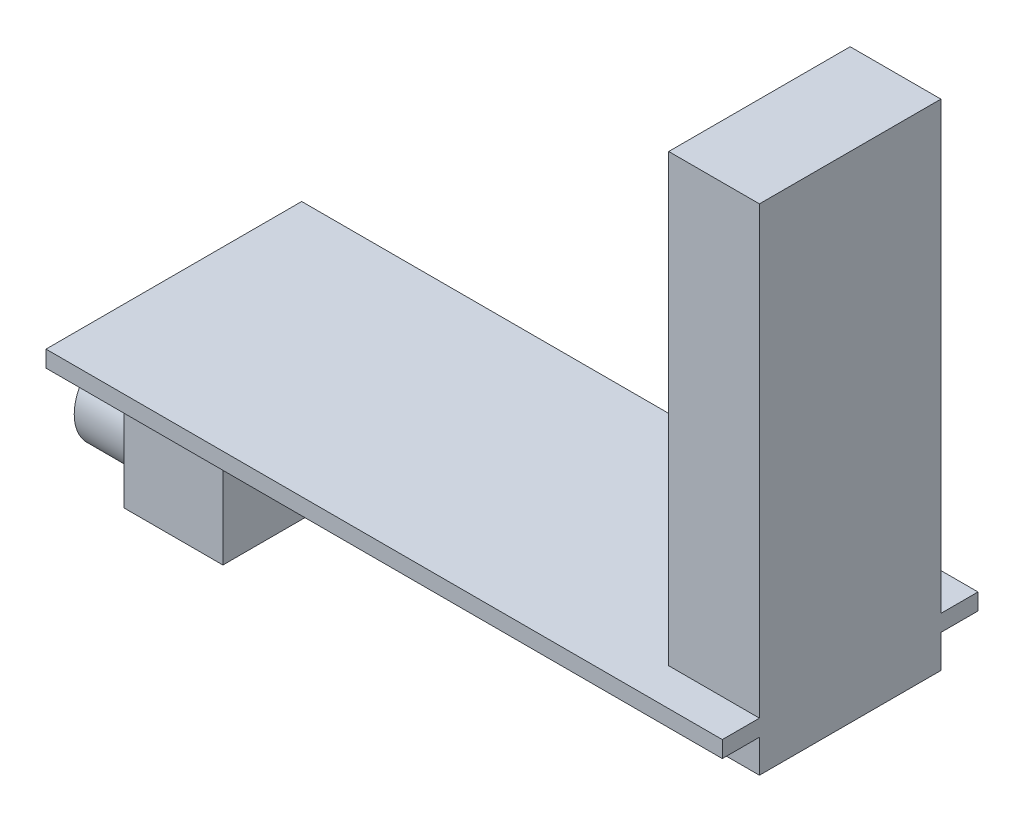
ISO-10303-21;
HEADER;
FILE_DESCRIPTION(('STEP AP214'),'2;1');
FILE_NAME('part.step','',(''),(''),'','','');
FILE_SCHEMA(('AUTOMOTIVE_DESIGN { 1 0 10303 214 1 1 1 1 }'));
ENDSEC;
DATA;
#1=APPLICATION_CONTEXT('core data for automotive mechanical design processes');
#2=APPLICATION_PROTOCOL_DEFINITION('international standard','automotive_design',2000,#1);
#3=PRODUCT_CONTEXT('',#1,'mechanical');
#4=PRODUCT('Part','Part','',(#3));
#5=PRODUCT_RELATED_PRODUCT_CATEGORY('part','',(#4));
#6=PRODUCT_DEFINITION_FORMATION('','',#4);
#7=PRODUCT_DEFINITION_CONTEXT('part definition',#1,'design');
#8=PRODUCT_DEFINITION('design','',#6,#7);
#9=PRODUCT_DEFINITION_SHAPE('','',#8);
#10=(LENGTH_UNIT() NAMED_UNIT(*) SI_UNIT(.MILLI.,.METRE.));
#11=(NAMED_UNIT(*) PLANE_ANGLE_UNIT() SI_UNIT($,.RADIAN.));
#12=(NAMED_UNIT(*) SI_UNIT($,.STERADIAN.) SOLID_ANGLE_UNIT());
#13=UNCERTAINTY_MEASURE_WITH_UNIT(LENGTH_MEASURE(1.E-05),#10,'distance_accuracy_value','');
#14=(GEOMETRIC_REPRESENTATION_CONTEXT(3) GLOBAL_UNCERTAINTY_ASSIGNED_CONTEXT((#13)) GLOBAL_UNIT_ASSIGNED_CONTEXT((#10,
#11,#12)) REPRESENTATION_CONTEXT('',''));
#15=CARTESIAN_POINT('',(0.,0.,0.));
#16=DIRECTION('',(0.,0.,1.));
#17=DIRECTION('',(1.,0.,0.));
#18=AXIS2_PLACEMENT_3D('',#15,#16,#17);
#19=CARTESIAN_POINT('',(0.,0.,0.));
#20=DIRECTION('',(0.,-1.,0.));
#21=DIRECTION('',(0.,0.,-1.));
#22=AXIS2_PLACEMENT_3D('',#19,#20,#21);
#23=PLANE('',#22);
#24=DIRECTION('',(0.,0.,1.));
#25=VECTOR('',#24,1.);
#26=CARTESIAN_POINT('',(-14.5,0.,0.));
#27=LINE('',#26,#25);
#28=CARTESIAN_POINT('',(-14.5,0.,-3.025));
#29=VERTEX_POINT('',#28);
#30=CARTESIAN_POINT('',(-14.5,0.,3.025));
#31=VERTEX_POINT('',#30);
#32=EDGE_CURVE('E531',#29,#31,#27,.T.);
#33=ORIENTED_EDGE('',*,*,#32,.F.);
#34=DIRECTION('',(1.,0.,0.));
#35=VECTOR('',#34,1.);
#36=CARTESIAN_POINT('',(0.,0.,-3.025));
#37=LINE('',#36,#35);
#38=CARTESIAN_POINT('',(-20.5,0.,-3.025));
#39=VERTEX_POINT('',#38);
#40=EDGE_CURVE('E183',#39,#29,#37,.T.);
#41=ORIENTED_EDGE('',*,*,#40,.F.);
#42=DIRECTION('',(0.,0.,1.));
#43=VECTOR('',#42,1.);
#44=CARTESIAN_POINT('',(-20.5,0.,7.75));
#45=LINE('',#44,#43);
#46=CARTESIAN_POINT('',(-20.5,0.,-7.75));
#47=VERTEX_POINT('',#46);
#48=EDGE_CURVE('E293',#47,#39,#45,.T.);
#49=ORIENTED_EDGE('',*,*,#48,.F.);
#50=DIRECTION('',(-1.,0.,0.));
#51=VECTOR('',#50,1.);
#52=CARTESIAN_POINT('',(-20.5,0.,-7.75));
#53=LINE('',#52,#51);
#54=CARTESIAN_POINT('',(20.5,0.,-7.75));
#55=VERTEX_POINT('',#54);
#56=EDGE_CURVE('E289',#55,#47,#53,.T.);
#57=ORIENTED_EDGE('',*,*,#56,.F.);
#58=DIRECTION('',(0.,0.,-1.));
#59=VECTOR('',#58,1.);
#60=CARTESIAN_POINT('',(20.5,0.,7.75));
#61=LINE('',#60,#59);
#62=CARTESIAN_POINT('',(20.5,0.,-5.5));
#63=VERTEX_POINT('',#62);
#64=EDGE_CURVE('E269',#63,#55,#61,.T.);
#65=ORIENTED_EDGE('',*,*,#64,.F.);
#66=DIRECTION('',(1.,0.,0.));
#67=VECTOR('',#66,1.);
#68=CARTESIAN_POINT('',(0.,0.,-5.5));
#69=LINE('',#68,#67);
#70=CARTESIAN_POINT('',(15.,0.,-5.5));
#71=VERTEX_POINT('',#70);
#72=EDGE_CURVE('E69',#71,#63,#69,.T.);
#73=ORIENTED_EDGE('',*,*,#72,.F.);
#74=DIRECTION('',(0.,0.,-1.));
#75=VECTOR('',#74,1.);
#76=CARTESIAN_POINT('',(15.,0.,0.));
#77=LINE('',#76,#75);
#78=CARTESIAN_POINT('',(15.,0.,5.5));
#79=VERTEX_POINT('',#78);
#80=EDGE_CURVE('E191',#79,#71,#77,.T.);
#81=ORIENTED_EDGE('',*,*,#80,.F.);
#82=DIRECTION('',(-1.,0.,0.));
#83=VECTOR('',#82,1.);
#84=CARTESIAN_POINT('',(0.,0.,5.5));
#85=LINE('',#84,#83);
#86=CARTESIAN_POINT('',(20.5,0.,5.5));
#87=VERTEX_POINT('',#86);
#88=EDGE_CURVE('E186',#87,#79,#85,.T.);
#89=ORIENTED_EDGE('',*,*,#88,.F.);
#90=CARTESIAN_POINT('',(20.5,0.,7.75));
#91=VERTEX_POINT('',#90);
#92=EDGE_CURVE('E285',#91,#87,#61,.T.);
#93=ORIENTED_EDGE('',*,*,#92,.F.);
#94=DIRECTION('',(1.,0.,0.));
#95=VECTOR('',#94,1.);
#96=CARTESIAN_POINT('',(-20.5,0.,7.75));
#97=LINE('',#96,#95);
#98=CARTESIAN_POINT('',(-20.5,0.,7.75));
#99=VERTEX_POINT('',#98);
#100=EDGE_CURVE('E297',#99,#91,#97,.T.);
#101=ORIENTED_EDGE('',*,*,#100,.F.);
#102=CARTESIAN_POINT('',(-20.5,0.,3.025));
#103=VERTEX_POINT('',#102);
#104=EDGE_CURVE('E292',#103,#99,#45,.T.);
#105=ORIENTED_EDGE('',*,*,#104,.F.);
#106=DIRECTION('',(1.,0.,0.));
#107=VECTOR('',#106,1.);
#108=CARTESIAN_POINT('',(0.,0.,3.025));
#109=LINE('',#108,#107);
#110=EDGE_CURVE('E61',#103,#31,#109,.T.);
#111=ORIENTED_EDGE('',*,*,#110,.T.);
#112=EDGE_LOOP('',(#33,#41,#49,#57,#65,#73,#81,#89,#93,#101,#105,#111));
#113=FACE_BOUND('',#112,.T.);
#114=ADVANCED_FACE('F45',(#113),#23,.T.);
#115=CARTESIAN_POINT('',(20.5,1.,7.75));
#116=DIRECTION('',(-1.,0.,0.));
#117=DIRECTION('',(0.,0.,1.));
#118=AXIS2_PLACEMENT_3D('',#115,#116,#117);
#119=PLANE('',#118);
#120=ORIENTED_EDGE('',*,*,#92,.T.);
#121=DIRECTION('',(0.,1.,0.));
#122=VECTOR('',#121,1.);
#123=CARTESIAN_POINT('',(20.5,-2.,5.5));
#124=LINE('',#123,#122);
#125=CARTESIAN_POINT('',(20.5,-2.,5.5));
#126=VERTEX_POINT('',#125);
#127=EDGE_CURVE('E226',#126,#87,#124,.T.);
#128=ORIENTED_EDGE('',*,*,#127,.F.);
#129=DIRECTION('',(0.,0.,1.));
#130=VECTOR('',#129,1.);
#131=CARTESIAN_POINT('',(20.5,-2.,0.));
#132=LINE('',#131,#130);
#133=CARTESIAN_POINT('',(20.5,-2.,-5.5));
#134=VERTEX_POINT('',#133);
#135=EDGE_CURVE('E197',#134,#126,#132,.T.);
#136=ORIENTED_EDGE('',*,*,#135,.F.);
#137=DIRECTION('',(0.,1.,0.));
#138=VECTOR('',#137,1.);
#139=CARTESIAN_POINT('',(20.5,-2.,-5.5));
#140=LINE('',#139,#138);
#141=EDGE_CURVE('E209',#134,#63,#140,.T.);
#142=ORIENTED_EDGE('',*,*,#141,.T.);
#143=ORIENTED_EDGE('',*,*,#64,.T.);
#144=DIRECTION('',(0.,-1.,0.));
#145=VECTOR('',#144,1.);
#146=CARTESIAN_POINT('',(20.5,1.,-7.75));
#147=LINE('',#146,#145);
#148=CARTESIAN_POINT('',(20.5,1.,-7.75));
#149=VERTEX_POINT('',#148);
#150=EDGE_CURVE('E54',#149,#55,#147,.T.);
#151=ORIENTED_EDGE('',*,*,#150,.F.);
#152=DIRECTION('',(0.,0.,-1.));
#153=VECTOR('',#152,1.);
#154=CARTESIAN_POINT('',(20.5,1.,7.75));
#155=LINE('',#154,#153);
#156=CARTESIAN_POINT('',(20.5,1.,-5.5));
#157=VERTEX_POINT('',#156);
#158=EDGE_CURVE('E275',#157,#149,#155,.T.);
#159=ORIENTED_EDGE('',*,*,#158,.F.);
#160=DIRECTION('',(0.,-1.,0.));
#161=VECTOR('',#160,1.);
#162=CARTESIAN_POINT('',(20.5,28.,-5.5));
#163=LINE('',#162,#161);
#164=CARTESIAN_POINT('',(20.5,28.,-5.5));
#165=VERTEX_POINT('',#164);
#166=EDGE_CURVE('E246',#165,#157,#163,.T.);
#167=ORIENTED_EDGE('',*,*,#166,.F.);
#168=DIRECTION('',(0.,0.,-1.));
#169=VECTOR('',#168,1.);
#170=CARTESIAN_POINT('',(20.5,28.,0.));
#171=LINE('',#170,#169);
#172=CARTESIAN_POINT('',(20.5,28.,5.5));
#173=VERTEX_POINT('',#172);
#174=EDGE_CURVE('E243',#173,#165,#171,.T.);
#175=ORIENTED_EDGE('',*,*,#174,.F.);
#176=DIRECTION('',(0.,-1.,0.));
#177=VECTOR('',#176,1.);
#178=CARTESIAN_POINT('',(20.5,28.,5.5));
#179=LINE('',#178,#177);
#180=CARTESIAN_POINT('',(20.5,1.,5.5));
#181=VERTEX_POINT('',#180);
#182=EDGE_CURVE('E258',#173,#181,#179,.T.);
#183=ORIENTED_EDGE('',*,*,#182,.T.);
#184=CARTESIAN_POINT('',(20.5,1.,7.75));
#185=VERTEX_POINT('',#184);
#186=EDGE_CURVE('E270',#185,#181,#155,.T.);
#187=ORIENTED_EDGE('',*,*,#186,.F.);
#188=DIRECTION('',(0.,-1.,0.));
#189=VECTOR('',#188,1.);
#190=CARTESIAN_POINT('',(20.5,1.,7.75));
#191=LINE('',#190,#189);
#192=EDGE_CURVE('E284',#185,#91,#191,.T.);
#193=ORIENTED_EDGE('',*,*,#192,.T.);
#194=EDGE_LOOP('',(#120,#128,#136,#142,#143,#151,#159,#167,#175,#183,#187,#193));
#195=FACE_BOUND('',#194,.T.);
#196=ADVANCED_FACE('F47',(#195),#119,.F.);
#197=CARTESIAN_POINT('',(-20.5,1.,-7.75));
#198=DIRECTION('',(0.,0.,1.));
#199=DIRECTION('',(1.,0.,0.));
#200=AXIS2_PLACEMENT_3D('',#197,#198,#199);
#201=PLANE('',#200);
#202=ORIENTED_EDGE('',*,*,#56,.T.);
#203=DIRECTION('',(0.,-1.,0.));
#204=VECTOR('',#203,1.);
#205=CARTESIAN_POINT('',(-20.5,1.,-7.75));
#206=LINE('',#205,#204);
#207=CARTESIAN_POINT('',(-20.5,1.,-7.75));
#208=VERTEX_POINT('',#207);
#209=EDGE_CURVE('E307',#208,#47,#206,.T.);
#210=ORIENTED_EDGE('',*,*,#209,.F.);
#211=DIRECTION('',(-1.,0.,0.));
#212=VECTOR('',#211,1.);
#213=CARTESIAN_POINT('',(-20.5,1.,-7.75));
#214=LINE('',#213,#212);
#215=EDGE_CURVE('E274',#149,#208,#214,.T.);
#216=ORIENTED_EDGE('',*,*,#215,.F.);
#217=ORIENTED_EDGE('',*,*,#150,.T.);
#218=EDGE_LOOP('',(#202,#210,#216,#217));
#219=FACE_BOUND('',#218,.T.);
#220=ADVANCED_FACE('F315',(#219),#201,.F.);
#221=CARTESIAN_POINT('',(-20.5,1.,7.75));
#222=DIRECTION('',(1.,0.,0.));
#223=DIRECTION('',(0.,0.,-1.));
#224=AXIS2_PLACEMENT_3D('',#221,#222,#223);
#225=PLANE('',#224);
#226=CARTESIAN_POINT('',(-20.5,-6.67922826841348,0.));
#227=DIRECTION('',(1.,0.,0.));
#228=DIRECTION('',(0.,0.,-1.));
#229=AXIS2_PLACEMENT_3D('',#226,#227,#228);
#230=CIRCLE('',#229,2.64);
#231=CARTESIAN_POINT('',(-20.5,-6.67922826841348,-2.64));
#232=VERTEX_POINT('',#231);
#233=EDGE_CURVE('E11',#232,#232,#230,.F.);
#234=ORIENTED_EDGE('',*,*,#233,.F.);
#235=EDGE_LOOP('',(#234));
#236=FACE_BOUND('',#235,.T.);
#237=ORIENTED_EDGE('',*,*,#48,.T.);
#238=DIRECTION('',(0.,1.,0.));
#239=VECTOR('',#238,1.);
#240=CARTESIAN_POINT('',(-20.5,-9.7,-3.025));
#241=LINE('',#240,#239);
#242=CARTESIAN_POINT('',(-20.5,-9.7,-3.025));
#243=VERTEX_POINT('',#242);
#244=EDGE_CURVE('E327',#243,#39,#241,.T.);
#245=ORIENTED_EDGE('',*,*,#244,.F.);
#246=DIRECTION('',(0.,0.,-1.));
#247=VECTOR('',#246,1.);
#248=CARTESIAN_POINT('',(-20.5,-9.7,0.));
#249=LINE('',#248,#247);
#250=CARTESIAN_POINT('',(-20.5,-9.7,3.025));
#251=VERTEX_POINT('',#250);
#252=EDGE_CURVE('E176',#251,#243,#249,.T.);
#253=ORIENTED_EDGE('',*,*,#252,.F.);
#254=DIRECTION('',(0.,1.,0.));
#255=VECTOR('',#254,1.);
#256=CARTESIAN_POINT('',(-20.5,-9.7,3.025));
#257=LINE('',#256,#255);
#258=EDGE_CURVE('E193',#251,#103,#257,.T.);
#259=ORIENTED_EDGE('',*,*,#258,.T.);
#260=ORIENTED_EDGE('',*,*,#104,.T.);
#261=DIRECTION('',(0.,-1.,0.));
#262=VECTOR('',#261,1.);
#263=CARTESIAN_POINT('',(-20.5,1.,7.75));
#264=LINE('',#263,#262);
#265=CARTESIAN_POINT('',(-20.5,1.,7.75));
#266=VERTEX_POINT('',#265);
#267=EDGE_CURVE('E303',#266,#99,#264,.T.);
#268=ORIENTED_EDGE('',*,*,#267,.F.);
#269=DIRECTION('',(0.,0.,1.));
#270=VECTOR('',#269,1.);
#271=CARTESIAN_POINT('',(-20.5,1.,7.75));
#272=LINE('',#271,#270);
#273=EDGE_CURVE('E278',#208,#266,#272,.T.);
#274=ORIENTED_EDGE('',*,*,#273,.F.);
#275=ORIENTED_EDGE('',*,*,#209,.T.);
#276=EDGE_LOOP('',(#237,#245,#253,#259,#260,#268,#274,#275));
#277=FACE_BOUND('',#276,.T.);
#278=ADVANCED_FACE('F326',(#236,#277),#225,.F.);
#279=CARTESIAN_POINT('',(-20.5,1.,7.75));
#280=DIRECTION('',(0.,0.,-1.));
#281=DIRECTION('',(-1.,0.,0.));
#282=AXIS2_PLACEMENT_3D('',#279,#280,#281);
#283=PLANE('',#282);
#284=ORIENTED_EDGE('',*,*,#100,.T.);
#285=ORIENTED_EDGE('',*,*,#192,.F.);
#286=DIRECTION('',(1.,0.,0.));
#287=VECTOR('',#286,1.);
#288=CARTESIAN_POINT('',(-20.5,1.,7.75));
#289=LINE('',#288,#287);
#290=EDGE_CURVE('E281',#266,#185,#289,.T.);
#291=ORIENTED_EDGE('',*,*,#290,.F.);
#292=ORIENTED_EDGE('',*,*,#267,.T.);
#293=EDGE_LOOP('',(#284,#285,#291,#292));
#294=FACE_BOUND('',#293,.T.);
#295=ADVANCED_FACE('F339',(#294),#283,.F.);
#296=CARTESIAN_POINT('',(0.,1.,0.));
#297=DIRECTION('',(0.,-1.,0.));
#298=DIRECTION('',(0.,0.,-1.));
#299=AXIS2_PLACEMENT_3D('',#296,#297,#298);
#300=PLANE('',#299);
#301=DIRECTION('',(0.,0.,-1.));
#302=VECTOR('',#301,1.);
#303=CARTESIAN_POINT('',(15.,1.,0.));
#304=LINE('',#303,#302);
#305=CARTESIAN_POINT('',(15.,1.,5.5));
#306=VERTEX_POINT('',#305);
#307=CARTESIAN_POINT('',(15.,1.,-5.5));
#308=VERTEX_POINT('',#307);
#309=EDGE_CURVE('E250',#306,#308,#304,.T.);
#310=ORIENTED_EDGE('',*,*,#309,.T.);
#311=DIRECTION('',(1.,0.,0.));
#312=VECTOR('',#311,1.);
#313=CARTESIAN_POINT('',(0.,1.,-5.5));
#314=LINE('',#313,#312);
#315=EDGE_CURVE('E230',#308,#157,#314,.T.);
#316=ORIENTED_EDGE('',*,*,#315,.T.);
#317=ORIENTED_EDGE('',*,*,#158,.T.);
#318=ORIENTED_EDGE('',*,*,#215,.T.);
#319=ORIENTED_EDGE('',*,*,#273,.T.);
#320=ORIENTED_EDGE('',*,*,#290,.T.);
#321=ORIENTED_EDGE('',*,*,#186,.T.);
#322=DIRECTION('',(1.,0.,0.));
#323=VECTOR('',#322,1.);
#324=CARTESIAN_POINT('',(0.,1.,5.5));
#325=LINE('',#324,#323);
#326=EDGE_CURVE('E236',#306,#181,#325,.T.);
#327=ORIENTED_EDGE('',*,*,#326,.F.);
#328=EDGE_LOOP('',(#310,#316,#317,#318,#319,#320,#321,#327));
#329=FACE_BOUND('',#328,.T.);
#330=ADVANCED_FACE('F332',(#329),#300,.F.);
#331=CARTESIAN_POINT('',(0.,28.,-5.5));
#332=DIRECTION('',(0.,0.,-1.));
#333=DIRECTION('',(-1.,0.,0.));
#334=AXIS2_PLACEMENT_3D('',#331,#332,#333);
#335=PLANE('',#334);
#336=ORIENTED_EDGE('',*,*,#315,.F.);
#337=DIRECTION('',(0.,-1.,0.));
#338=VECTOR('',#337,1.);
#339=CARTESIAN_POINT('',(15.,28.,-5.5));
#340=LINE('',#339,#338);
#341=CARTESIAN_POINT('',(15.,28.,-5.5));
#342=VERTEX_POINT('',#341);
#343=EDGE_CURVE('E265',#342,#308,#340,.T.);
#344=ORIENTED_EDGE('',*,*,#343,.F.);
#345=DIRECTION('',(1.,0.,0.));
#346=VECTOR('',#345,1.);
#347=CARTESIAN_POINT('',(0.,28.,-5.5));
#348=LINE('',#347,#346);
#349=EDGE_CURVE('E231',#342,#165,#348,.T.);
#350=ORIENTED_EDGE('',*,*,#349,.T.);
#351=ORIENTED_EDGE('',*,*,#166,.T.);
#352=EDGE_LOOP('',(#336,#344,#350,#351));
#353=FACE_BOUND('',#352,.T.);
#354=ADVANCED_FACE('F397',(#353),#335,.T.);
#355=CARTESIAN_POINT('',(15.,28.,0.));
#356=DIRECTION('',(-1.,0.,0.));
#357=DIRECTION('',(0.,0.,1.));
#358=AXIS2_PLACEMENT_3D('',#355,#356,#357);
#359=PLANE('',#358);
#360=ORIENTED_EDGE('',*,*,#309,.F.);
#361=DIRECTION('',(0.,-1.,0.));
#362=VECTOR('',#361,1.);
#363=CARTESIAN_POINT('',(15.,28.,5.5));
#364=LINE('',#363,#362);
#365=CARTESIAN_POINT('',(15.,28.,5.5));
#366=VERTEX_POINT('',#365);
#367=EDGE_CURVE('E262',#366,#306,#364,.T.);
#368=ORIENTED_EDGE('',*,*,#367,.F.);
#369=DIRECTION('',(0.,0.,-1.));
#370=VECTOR('',#369,1.);
#371=CARTESIAN_POINT('',(15.,28.,0.));
#372=LINE('',#371,#370);
#373=EDGE_CURVE('E235',#366,#342,#372,.T.);
#374=ORIENTED_EDGE('',*,*,#373,.T.);
#375=ORIENTED_EDGE('',*,*,#343,.T.);
#376=EDGE_LOOP('',(#360,#368,#374,#375));
#377=FACE_BOUND('',#376,.T.);
#378=ADVANCED_FACE('F403',(#377),#359,.T.);
#379=CARTESIAN_POINT('',(0.,28.,5.5));
#380=DIRECTION('',(0.,0.,-1.));
#381=DIRECTION('',(-1.,0.,0.));
#382=AXIS2_PLACEMENT_3D('',#379,#380,#381);
#383=PLANE('',#382);
#384=ORIENTED_EDGE('',*,*,#326,.T.);
#385=ORIENTED_EDGE('',*,*,#182,.F.);
#386=DIRECTION('',(1.,0.,0.));
#387=VECTOR('',#386,1.);
#388=CARTESIAN_POINT('',(0.,28.,5.5));
#389=LINE('',#388,#387);
#390=EDGE_CURVE('E240',#366,#173,#389,.T.);
#391=ORIENTED_EDGE('',*,*,#390,.F.);
#392=ORIENTED_EDGE('',*,*,#367,.T.);
#393=EDGE_LOOP('',(#384,#385,#391,#392));
#394=FACE_BOUND('',#393,.T.);
#395=ADVANCED_FACE('F410',(#394),#383,.F.);
#396=CARTESIAN_POINT('',(0.,28.,0.));
#397=DIRECTION('',(0.,1.,0.));
#398=DIRECTION('',(0.,0.,1.));
#399=AXIS2_PLACEMENT_3D('',#396,#397,#398);
#400=PLANE('',#399);
#401=ORIENTED_EDGE('',*,*,#349,.F.);
#402=ORIENTED_EDGE('',*,*,#373,.F.);
#403=ORIENTED_EDGE('',*,*,#390,.T.);
#404=ORIENTED_EDGE('',*,*,#174,.T.);
#405=EDGE_LOOP('',(#401,#402,#403,#404));
#406=FACE_BOUND('',#405,.T.);
#407=ADVANCED_FACE('F362',(#406),#400,.T.);
#408=CARTESIAN_POINT('',(0.,-2.,5.5));
#409=DIRECTION('',(0.,0.,-1.));
#410=DIRECTION('',(-1.,0.,0.));
#411=AXIS2_PLACEMENT_3D('',#408,#409,#410);
#412=PLANE('',#411);
#413=ORIENTED_EDGE('',*,*,#88,.T.);
#414=DIRECTION('',(0.,1.,0.));
#415=VECTOR('',#414,1.);
#416=CARTESIAN_POINT('',(15.,-2.,5.5));
#417=LINE('',#416,#415);
#418=CARTESIAN_POINT('',(15.,-2.,5.5));
#419=VERTEX_POINT('',#418);
#420=EDGE_CURVE('E222',#419,#79,#417,.T.);
#421=ORIENTED_EDGE('',*,*,#420,.F.);
#422=DIRECTION('',(-1.,0.,0.));
#423=VECTOR('',#422,1.);
#424=CARTESIAN_POINT('',(0.,-2.,5.5));
#425=LINE('',#424,#423);
#426=EDGE_CURVE('E201',#126,#419,#425,.T.);
#427=ORIENTED_EDGE('',*,*,#426,.F.);
#428=ORIENTED_EDGE('',*,*,#127,.T.);
#429=EDGE_LOOP('',(#413,#421,#427,#428));
#430=FACE_BOUND('',#429,.T.);
#431=ADVANCED_FACE('F344',(#430),#412,.F.);
#432=CARTESIAN_POINT('',(15.,-2.,0.));
#433=DIRECTION('',(1.,0.,0.));
#434=DIRECTION('',(0.,0.,-1.));
#435=AXIS2_PLACEMENT_3D('',#432,#433,#434);
#436=PLANE('',#435);
#437=ORIENTED_EDGE('',*,*,#80,.T.);
#438=DIRECTION('',(0.,1.,0.));
#439=VECTOR('',#438,1.);
#440=CARTESIAN_POINT('',(15.,-2.,-5.5));
#441=LINE('',#440,#439);
#442=CARTESIAN_POINT('',(15.,-2.,-5.5));
#443=VERTEX_POINT('',#442);
#444=EDGE_CURVE('E218',#443,#71,#441,.T.);
#445=ORIENTED_EDGE('',*,*,#444,.F.);
#446=DIRECTION('',(0.,0.,-1.));
#447=VECTOR('',#446,1.);
#448=CARTESIAN_POINT('',(15.,-2.,0.));
#449=LINE('',#448,#447);
#450=EDGE_CURVE('E204',#419,#443,#449,.T.);
#451=ORIENTED_EDGE('',*,*,#450,.F.);
#452=ORIENTED_EDGE('',*,*,#420,.T.);
#453=EDGE_LOOP('',(#437,#445,#451,#452));
#454=FACE_BOUND('',#453,.T.);
#455=ADVANCED_FACE('F354',(#454),#436,.F.);
#456=CARTESIAN_POINT('',(0.,-2.,-5.5));
#457=DIRECTION('',(0.,0.,1.));
#458=DIRECTION('',(1.,0.,0.));
#459=AXIS2_PLACEMENT_3D('',#456,#457,#458);
#460=PLANE('',#459);
#461=ORIENTED_EDGE('',*,*,#72,.T.);
#462=ORIENTED_EDGE('',*,*,#141,.F.);
#463=DIRECTION('',(1.,0.,0.));
#464=VECTOR('',#463,1.);
#465=CARTESIAN_POINT('',(0.,-2.,-5.5));
#466=LINE('',#465,#464);
#467=EDGE_CURVE('E207',#443,#134,#466,.T.);
#468=ORIENTED_EDGE('',*,*,#467,.F.);
#469=ORIENTED_EDGE('',*,*,#444,.T.);
#470=EDGE_LOOP('',(#461,#462,#468,#469));
#471=FACE_BOUND('',#470,.T.);
#472=ADVANCED_FACE('F352',(#471),#460,.F.);
#473=CARTESIAN_POINT('',(0.,-2.,0.));
#474=DIRECTION('',(0.,-1.,0.));
#475=DIRECTION('',(0.,0.,-1.));
#476=AXIS2_PLACEMENT_3D('',#473,#474,#475);
#477=PLANE('',#476);
#478=ORIENTED_EDGE('',*,*,#135,.T.);
#479=ORIENTED_EDGE('',*,*,#426,.T.);
#480=ORIENTED_EDGE('',*,*,#450,.T.);
#481=ORIENTED_EDGE('',*,*,#467,.T.);
#482=EDGE_LOOP('',(#478,#479,#480,#481));
#483=FACE_BOUND('',#482,.T.);
#484=ADVANCED_FACE('F348',(#483),#477,.T.);
#485=CARTESIAN_POINT('',(0.,-9.7,-3.025));
#486=DIRECTION('',(0.,0.,1.));
#487=DIRECTION('',(1.,0.,0.));
#488=AXIS2_PLACEMENT_3D('',#485,#486,#487);
#489=PLANE('',#488);
#490=ORIENTED_EDGE('',*,*,#40,.T.);
#491=DIRECTION('',(0.,1.,0.));
#492=VECTOR('',#491,1.);
#493=CARTESIAN_POINT('',(-14.5,-9.7,-3.025));
#494=LINE('',#493,#492);
#495=CARTESIAN_POINT('',(-14.5,-9.7,-3.025));
#496=VERTEX_POINT('',#495);
#497=EDGE_CURVE('E163',#496,#29,#494,.T.);
#498=ORIENTED_EDGE('',*,*,#497,.F.);
#499=DIRECTION('',(1.,0.,0.));
#500=VECTOR('',#499,1.);
#501=CARTESIAN_POINT('',(0.,-9.7,-3.025));
#502=LINE('',#501,#500);
#503=EDGE_CURVE('E171',#243,#496,#502,.T.);
#504=ORIENTED_EDGE('',*,*,#503,.F.);
#505=ORIENTED_EDGE('',*,*,#244,.T.);
#506=EDGE_LOOP('',(#490,#498,#504,#505));
#507=FACE_BOUND('',#506,.T.);
#508=ADVANCED_FACE('F181',(#507),#489,.F.);
#509=CARTESIAN_POINT('',(-14.5,-9.7,0.));
#510=DIRECTION('',(-1.,0.,0.));
#511=DIRECTION('',(0.,0.,1.));
#512=AXIS2_PLACEMENT_3D('',#509,#510,#511);
#513=PLANE('',#512);
#514=ORIENTED_EDGE('',*,*,#32,.T.);
#515=DIRECTION('',(0.,1.,0.));
#516=VECTOR('',#515,1.);
#517=CARTESIAN_POINT('',(-14.5,-9.7,3.025));
#518=LINE('',#517,#516);
#519=CARTESIAN_POINT('',(-14.5,-9.7,3.025));
#520=VERTEX_POINT('',#519);
#521=EDGE_CURVE('E165',#520,#31,#518,.T.);
#522=ORIENTED_EDGE('',*,*,#521,.F.);
#523=DIRECTION('',(0.,0.,1.));
#524=VECTOR('',#523,1.);
#525=CARTESIAN_POINT('',(-14.5,-9.7,0.));
#526=LINE('',#525,#524);
#527=EDGE_CURVE('E158',#496,#520,#526,.T.);
#528=ORIENTED_EDGE('',*,*,#527,.F.);
#529=ORIENTED_EDGE('',*,*,#497,.T.);
#530=EDGE_LOOP('',(#514,#522,#528,#529));
#531=FACE_BOUND('',#530,.T.);
#532=ADVANCED_FACE('F161',(#531),#513,.F.);
#533=CARTESIAN_POINT('',(0.,-9.7,3.025));
#534=DIRECTION('',(0.,0.,1.));
#535=DIRECTION('',(1.,0.,0.));
#536=AXIS2_PLACEMENT_3D('',#533,#534,#535);
#537=PLANE('',#536);
#538=ORIENTED_EDGE('',*,*,#110,.F.);
#539=ORIENTED_EDGE('',*,*,#258,.F.);
#540=DIRECTION('',(1.,0.,0.));
#541=VECTOR('',#540,1.);
#542=CARTESIAN_POINT('',(0.,-9.7,3.025));
#543=LINE('',#542,#541);
#544=EDGE_CURVE('E170',#251,#520,#543,.T.);
#545=ORIENTED_EDGE('',*,*,#544,.T.);
#546=ORIENTED_EDGE('',*,*,#521,.T.);
#547=EDGE_LOOP('',(#538,#539,#545,#546));
#548=FACE_BOUND('',#547,.T.);
#549=ADVANCED_FACE('F476',(#548),#537,.T.);
#550=CARTESIAN_POINT('',(0.,-9.7,0.));
#551=DIRECTION('',(0.,-1.,0.));
#552=DIRECTION('',(0.,0.,-1.));
#553=AXIS2_PLACEMENT_3D('',#550,#551,#552);
#554=PLANE('',#553);
#555=ORIENTED_EDGE('',*,*,#503,.T.);
#556=ORIENTED_EDGE('',*,*,#527,.T.);
#557=ORIENTED_EDGE('',*,*,#544,.F.);
#558=ORIENTED_EDGE('',*,*,#252,.T.);
#559=EDGE_LOOP('',(#555,#556,#557,#558));
#560=FACE_BOUND('',#559,.T.);
#561=ADVANCED_FACE('F174',(#560),#554,.T.);
#562=CARTESIAN_POINT('',(-23.9,-6.67922826841348,0.));
#563=DIRECTION('',(1.,0.,0.));
#564=DIRECTION('',(0.,0.,-1.));
#565=AXIS2_PLACEMENT_3D('',#562,#563,#564);
#566=CYLINDRICAL_SURFACE('',#565,2.64);
#567=CARTESIAN_POINT('',(-23.9,-6.67922826841348,0.));
#568=DIRECTION('',(-1.,0.,0.));
#569=DIRECTION('',(0.,0.,1.));
#570=AXIS2_PLACEMENT_3D('',#567,#568,#569);
#571=CIRCLE('',#570,2.64);
#572=CARTESIAN_POINT('',(-23.9,-6.67922826841348,2.64));
#573=VERTEX_POINT('',#572);
#574=EDGE_CURVE('E527',#573,#573,#571,.T.);
#575=ORIENTED_EDGE('',*,*,#574,.F.);
#576=EDGE_LOOP('',(#575));
#577=FACE_BOUND('',#576,.T.);
#578=ORIENTED_EDGE('',*,*,#233,.T.);
#579=EDGE_LOOP('',(#578));
#580=FACE_BOUND('',#579,.T.);
#581=ADVANCED_FACE('F493',(#577,#580),#566,.T.);
#582=CARTESIAN_POINT('',(-23.9,0.,0.));
#583=DIRECTION('',(-1.,0.,0.));
#584=DIRECTION('',(0.,0.,1.));
#585=AXIS2_PLACEMENT_3D('',#582,#583,#584);
#586=PLANE('',#585);
#587=ORIENTED_EDGE('',*,*,#574,.T.);
#588=EDGE_LOOP('',(#587));
#589=FACE_BOUND('',#588,.T.);
#590=ADVANCED_FACE('F503',(#589),#586,.T.);
#591=CLOSED_SHELL('',(#114,#196,#220,#278,#295,#330,#354,#378,#395,#407,#431,#455,#472,#484,
#508,#532,#549,#561,#581,#590));
#592=MANIFOLD_SOLID_BREP('B2',#591);
#593=ADVANCED_BREP_SHAPE_REPRESENTATION('',(#18,#592),#14);
#594=SHAPE_DEFINITION_REPRESENTATION(#9,#593);
ENDSEC;
END-ISO-10303-21;
